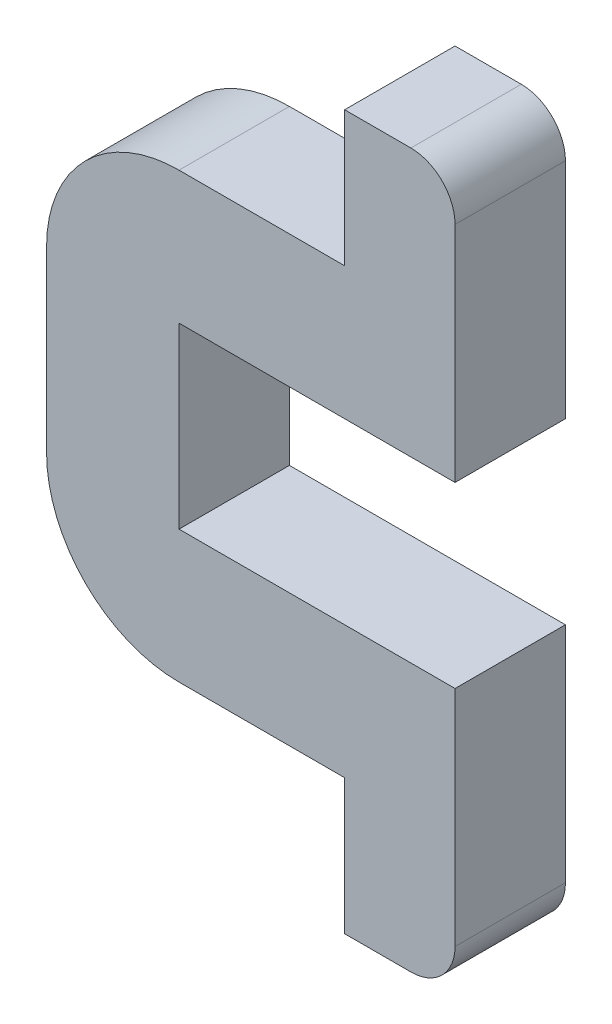
ISO-10303-21;
HEADER;
FILE_DESCRIPTION(('STEP AP214'),'2;1');
FILE_NAME('part.step','',(''),(''),'','','');
FILE_SCHEMA(('AUTOMOTIVE_DESIGN { 1 0 10303 214 1 1 1 1 }'));
ENDSEC;
DATA;
#1=APPLICATION_CONTEXT('core data for automotive mechanical design processes');
#2=APPLICATION_PROTOCOL_DEFINITION('international standard','automotive_design',2000,#1);
#3=PRODUCT_CONTEXT('',#1,'mechanical');
#4=PRODUCT('Part','Part','',(#3));
#5=PRODUCT_RELATED_PRODUCT_CATEGORY('part','',(#4));
#6=PRODUCT_DEFINITION_FORMATION('','',#4);
#7=PRODUCT_DEFINITION_CONTEXT('part definition',#1,'design');
#8=PRODUCT_DEFINITION('design','',#6,#7);
#9=PRODUCT_DEFINITION_SHAPE('','',#8);
#10=(LENGTH_UNIT() NAMED_UNIT(*) SI_UNIT(.MILLI.,.METRE.));
#11=(NAMED_UNIT(*) PLANE_ANGLE_UNIT() SI_UNIT($,.RADIAN.));
#12=(NAMED_UNIT(*) SI_UNIT($,.STERADIAN.) SOLID_ANGLE_UNIT());
#13=UNCERTAINTY_MEASURE_WITH_UNIT(LENGTH_MEASURE(1.E-05),#10,'distance_accuracy_value','');
#14=(GEOMETRIC_REPRESENTATION_CONTEXT(3) GLOBAL_UNCERTAINTY_ASSIGNED_CONTEXT((#13)) GLOBAL_UNIT_ASSIGNED_CONTEXT((#10,
#11,#12)) REPRESENTATION_CONTEXT('',''));
#15=CARTESIAN_POINT('',(0.,0.,0.));
#16=DIRECTION('',(0.,0.,1.));
#17=DIRECTION('',(1.,0.,0.));
#18=AXIS2_PLACEMENT_3D('',#15,#16,#17);
#19=CARTESIAN_POINT('',(0.,-0.606,0.125));
#20=DIRECTION('',(-1.,0.,0.));
#21=DIRECTION('',(0.,0.,1.));
#22=AXIS2_PLACEMENT_3D('',#19,#20,#21);
#23=PLANE('',#22);
#24=DIRECTION('',(0.,1.,0.));
#25=VECTOR('',#24,1.);
#26=CARTESIAN_POINT('',(0.,-0.606,0.125));
#27=LINE('',#26,#25);
#28=CARTESIAN_POINT('',(0.,-0.506,0.125));
#29=VERTEX_POINT('',#28);
#30=CARTESIAN_POINT('',(0.,0.,0.125));
#31=VERTEX_POINT('',#30);
#32=EDGE_CURVE('E143',#29,#31,#27,.T.);
#33=ORIENTED_EDGE('',*,*,#32,.F.);
#34=DIRECTION('',(0.,0.,-1.));
#35=VECTOR('',#34,1.);
#36=CARTESIAN_POINT('',(0.,-0.506,0.125));
#37=LINE('',#36,#35);
#38=CARTESIAN_POINT('',(0.,-0.506,-0.125));
#39=VERTEX_POINT('',#38);
#40=EDGE_CURVE('E41',#29,#39,#37,.T.);
#41=ORIENTED_EDGE('',*,*,#40,.T.);
#42=DIRECTION('',(0.,1.,0.));
#43=VECTOR('',#42,1.);
#44=CARTESIAN_POINT('',(0.,-0.606,-0.125));
#45=LINE('',#44,#43);
#46=CARTESIAN_POINT('',(0.,0.,-0.125));
#47=VERTEX_POINT('',#46);
#48=EDGE_CURVE('E165',#39,#47,#45,.T.);
#49=ORIENTED_EDGE('',*,*,#48,.T.);
#50=DIRECTION('',(0.,0.,-1.));
#51=VECTOR('',#50,1.);
#52=CARTESIAN_POINT('',(0.,0.,0.125));
#53=LINE('',#52,#51);
#54=EDGE_CURVE('E158',#31,#47,#53,.T.);
#55=ORIENTED_EDGE('',*,*,#54,.F.);
#56=EDGE_LOOP('',(#33,#41,#49,#55));
#57=FACE_BOUND('',#56,.T.);
#58=ADVANCED_FACE('F33',(#57),#23,.F.);
#59=CARTESIAN_POINT('',(0.,0.,0.125));
#60=DIRECTION('',(0.,-1.,0.));
#61=DIRECTION('',(1.,0.,0.));
#62=AXIS2_PLACEMENT_3D('',#59,#60,#61);
#63=PLANE('',#62);
#64=DIRECTION('',(-1.,0.,0.));
#65=VECTOR('',#64,1.);
#66=CARTESIAN_POINT('',(0.,0.,-0.125));
#67=LINE('',#66,#65);
#68=CARTESIAN_POINT('',(-0.625,0.,-0.125));
#69=VERTEX_POINT('',#68);
#70=EDGE_CURVE('E207',#47,#69,#67,.T.);
#71=ORIENTED_EDGE('',*,*,#70,.T.);
#72=DIRECTION('',(0.,0.,-1.));
#73=VECTOR('',#72,1.);
#74=CARTESIAN_POINT('',(-0.625,0.,0.125));
#75=LINE('',#74,#73);
#76=CARTESIAN_POINT('',(-0.625,0.,0.125));
#77=VERTEX_POINT('',#76);
#78=EDGE_CURVE('E160',#77,#69,#75,.T.);
#79=ORIENTED_EDGE('',*,*,#78,.F.);
#80=DIRECTION('',(-1.,0.,0.));
#81=VECTOR('',#80,1.);
#82=CARTESIAN_POINT('',(0.,0.,0.125));
#83=LINE('',#82,#81);
#84=EDGE_CURVE('E147',#31,#77,#83,.T.);
#85=ORIENTED_EDGE('',*,*,#84,.F.);
#86=ORIENTED_EDGE('',*,*,#54,.T.);
#87=EDGE_LOOP('',(#71,#79,#85,#86));
#88=FACE_BOUND('',#87,.T.);
#89=ADVANCED_FACE('F157',(#88),#63,.F.);
#90=CARTESIAN_POINT('',(-0.625,0.,0.125));
#91=DIRECTION('',(-1.,0.,0.));
#92=DIRECTION('',(0.,0.,1.));
#93=AXIS2_PLACEMENT_3D('',#90,#91,#92);
#94=PLANE('',#93);
#95=DIRECTION('',(0.,1.,0.));
#96=VECTOR('',#95,1.);
#97=CARTESIAN_POINT('',(-0.625,0.,-0.125));
#98=LINE('',#97,#96);
#99=CARTESIAN_POINT('',(-0.625,0.404,-0.125));
#100=VERTEX_POINT('',#99);
#101=EDGE_CURVE('E209',#69,#100,#98,.T.);
#102=ORIENTED_EDGE('',*,*,#101,.T.);
#103=DIRECTION('',(0.,0.,-1.));
#104=VECTOR('',#103,1.);
#105=CARTESIAN_POINT('',(-0.625,0.404,0.125));
#106=LINE('',#105,#104);
#107=CARTESIAN_POINT('',(-0.625,0.404,0.125));
#108=VERTEX_POINT('',#107);
#109=EDGE_CURVE('E172',#108,#100,#106,.T.);
#110=ORIENTED_EDGE('',*,*,#109,.F.);
#111=DIRECTION('',(0.,1.,0.));
#112=VECTOR('',#111,1.);
#113=CARTESIAN_POINT('',(-0.625,0.,0.125));
#114=LINE('',#113,#112);
#115=EDGE_CURVE('E162',#77,#108,#114,.T.);
#116=ORIENTED_EDGE('',*,*,#115,.F.);
#117=ORIENTED_EDGE('',*,*,#78,.T.);
#118=EDGE_LOOP('',(#102,#110,#116,#117));
#119=FACE_BOUND('',#118,.T.);
#120=ADVANCED_FACE('F301',(#119),#94,.F.);
#121=CARTESIAN_POINT('',(-0.625,0.404,0.125));
#122=DIRECTION('',(0.,1.,0.));
#123=DIRECTION('',(-1.,0.,0.));
#124=AXIS2_PLACEMENT_3D('',#121,#122,#123);
#125=PLANE('',#124);
#126=DIRECTION('',(1.,0.,0.));
#127=VECTOR('',#126,1.);
#128=CARTESIAN_POINT('',(-0.625,0.404,-0.125));
#129=LINE('',#128,#127);
#130=CARTESIAN_POINT('',(0.,0.404,-0.125));
#131=VERTEX_POINT('',#130);
#132=EDGE_CURVE('E216',#100,#131,#129,.T.);
#133=ORIENTED_EDGE('',*,*,#132,.T.);
#134=DIRECTION('',(0.,0.,-1.));
#135=VECTOR('',#134,1.);
#136=CARTESIAN_POINT('',(0.,0.404,0.125));
#137=LINE('',#136,#135);
#138=CARTESIAN_POINT('',(0.,0.404,0.125));
#139=VERTEX_POINT('',#138);
#140=EDGE_CURVE('E248',#139,#131,#137,.T.);
#141=ORIENTED_EDGE('',*,*,#140,.F.);
#142=DIRECTION('',(1.,0.,0.));
#143=VECTOR('',#142,1.);
#144=CARTESIAN_POINT('',(-0.625,0.404,0.125));
#145=LINE('',#144,#143);
#146=EDGE_CURVE('E257',#108,#139,#145,.T.);
#147=ORIENTED_EDGE('',*,*,#146,.F.);
#148=ORIENTED_EDGE('',*,*,#109,.T.);
#149=EDGE_LOOP('',(#133,#141,#147,#148));
#150=FACE_BOUND('',#149,.T.);
#151=ADVANCED_FACE('F255',(#150),#125,.F.);
#152=CARTESIAN_POINT('',(0.,0.404,0.125));
#153=DIRECTION('',(-1.,0.,0.));
#154=DIRECTION('',(0.,-1.,0.));
#155=AXIS2_PLACEMENT_3D('',#152,#153,#154);
#156=PLANE('',#155);
#157=DIRECTION('',(0.,1.,0.));
#158=VECTOR('',#157,1.);
#159=CARTESIAN_POINT('',(0.,0.404,-0.125));
#160=LINE('',#159,#158);
#161=CARTESIAN_POINT('',(0.,0.91,-0.125));
#162=VERTEX_POINT('',#161);
#163=EDGE_CURVE('E218',#131,#162,#160,.T.);
#164=ORIENTED_EDGE('',*,*,#163,.T.);
#165=DIRECTION('',(0.,0.,-1.));
#166=VECTOR('',#165,1.);
#167=CARTESIAN_POINT('',(0.,0.91,0.125));
#168=LINE('',#167,#166);
#169=CARTESIAN_POINT('',(0.,0.91,0.125));
#170=VERTEX_POINT('',#169);
#171=EDGE_CURVE('E197',#162,#170,#168,.F.);
#172=ORIENTED_EDGE('',*,*,#171,.T.);
#173=DIRECTION('',(0.,1.,0.));
#174=VECTOR('',#173,1.);
#175=CARTESIAN_POINT('',(0.,0.404,0.125));
#176=LINE('',#175,#174);
#177=EDGE_CURVE('E271',#139,#170,#176,.T.);
#178=ORIENTED_EDGE('',*,*,#177,.F.);
#179=ORIENTED_EDGE('',*,*,#140,.T.);
#180=EDGE_LOOP('',(#164,#172,#178,#179));
#181=FACE_BOUND('',#180,.T.);
#182=ADVANCED_FACE('F262',(#181),#156,.F.);
#183=CARTESIAN_POINT('',(0.,1.01,0.125));
#184=DIRECTION('',(0.,-1.,0.));
#185=DIRECTION('',(0.,0.,-1.));
#186=AXIS2_PLACEMENT_3D('',#183,#184,#185);
#187=PLANE('',#186);
#188=DIRECTION('',(-1.,0.,0.));
#189=VECTOR('',#188,1.);
#190=CARTESIAN_POINT('',(0.,1.01,0.125));
#191=LINE('',#190,#189);
#192=CARTESIAN_POINT('',(-0.1,1.01,0.125));
#193=VERTEX_POINT('',#192);
#194=CARTESIAN_POINT('',(-0.25,1.01,0.125));
#195=VERTEX_POINT('',#194);
#196=EDGE_CURVE('E269',#193,#195,#191,.T.);
#197=ORIENTED_EDGE('',*,*,#196,.F.);
#198=DIRECTION('',(0.,0.,-1.));
#199=VECTOR('',#198,1.);
#200=CARTESIAN_POINT('',(-0.1,1.01,0.125));
#201=LINE('',#200,#199);
#202=CARTESIAN_POINT('',(-0.1,1.01,-0.125));
#203=VERTEX_POINT('',#202);
#204=EDGE_CURVE('E190',#193,#203,#201,.T.);
#205=ORIENTED_EDGE('',*,*,#204,.T.);
#206=DIRECTION('',(-1.,0.,0.));
#207=VECTOR('',#206,1.);
#208=CARTESIAN_POINT('',(0.,1.01,-0.125));
#209=LINE('',#208,#207);
#210=CARTESIAN_POINT('',(-0.25,1.01,-0.125));
#211=VERTEX_POINT('',#210);
#212=EDGE_CURVE('E221',#203,#211,#209,.T.);
#213=ORIENTED_EDGE('',*,*,#212,.T.);
#214=DIRECTION('',(0.,0.,-1.));
#215=VECTOR('',#214,1.);
#216=CARTESIAN_POINT('',(-0.25,1.01,0.125));
#217=LINE('',#216,#215);
#218=EDGE_CURVE('E245',#195,#211,#217,.T.);
#219=ORIENTED_EDGE('',*,*,#218,.F.);
#220=EDGE_LOOP('',(#197,#205,#213,#219));
#221=FACE_BOUND('',#220,.T.);
#222=ADVANCED_FACE('F273',(#221),#187,.F.);
#223=CARTESIAN_POINT('',(-0.25,1.01,0.125));
#224=DIRECTION('',(1.,0.,0.));
#225=DIRECTION('',(0.,1.,0.));
#226=AXIS2_PLACEMENT_3D('',#223,#224,#225);
#227=PLANE('',#226);
#228=DIRECTION('',(0.,-1.,0.));
#229=VECTOR('',#228,1.);
#230=CARTESIAN_POINT('',(-0.25,1.01,-0.125));
#231=LINE('',#230,#229);
#232=CARTESIAN_POINT('',(-0.25,0.704,-0.125));
#233=VERTEX_POINT('',#232);
#234=EDGE_CURVE('E223',#211,#233,#231,.T.);
#235=ORIENTED_EDGE('',*,*,#234,.T.);
#236=DIRECTION('',(0.,0.,-1.));
#237=VECTOR('',#236,1.);
#238=CARTESIAN_POINT('',(-0.25,0.704,0.125));
#239=LINE('',#238,#237);
#240=CARTESIAN_POINT('',(-0.25,0.704,0.125));
#241=VERTEX_POINT('',#240);
#242=EDGE_CURVE('E242',#241,#233,#239,.T.);
#243=ORIENTED_EDGE('',*,*,#242,.F.);
#244=DIRECTION('',(0.,-1.,0.));
#245=VECTOR('',#244,1.);
#246=CARTESIAN_POINT('',(-0.25,1.01,0.125));
#247=LINE('',#246,#245);
#248=EDGE_CURVE('E275',#195,#241,#247,.T.);
#249=ORIENTED_EDGE('',*,*,#248,.F.);
#250=ORIENTED_EDGE('',*,*,#218,.T.);
#251=EDGE_LOOP('',(#235,#243,#249,#250));
#252=FACE_BOUND('',#251,.T.);
#253=ADVANCED_FACE('F339',(#252),#227,.F.);
#254=CARTESIAN_POINT('',(-0.25,0.704,0.125));
#255=DIRECTION('',(0.,-1.,0.));
#256=DIRECTION('',(0.,0.,-1.));
#257=AXIS2_PLACEMENT_3D('',#254,#255,#256);
#258=PLANE('',#257);
#259=DIRECTION('',(-1.,0.,0.));
#260=VECTOR('',#259,1.);
#261=CARTESIAN_POINT('',(-0.25,0.704,-0.125));
#262=LINE('',#261,#260);
#263=CARTESIAN_POINT('',(-0.625,0.704,-0.125));
#264=VERTEX_POINT('',#263);
#265=EDGE_CURVE('E225',#233,#264,#262,.T.);
#266=ORIENTED_EDGE('',*,*,#265,.T.);
#267=DIRECTION('',(0.,0.,-1.));
#268=VECTOR('',#267,1.);
#269=CARTESIAN_POINT('',(-0.625,0.704,0.125));
#270=LINE('',#269,#268);
#271=CARTESIAN_POINT('',(-0.625,0.704,0.125));
#272=VERTEX_POINT('',#271);
#273=EDGE_CURVE('E188',#264,#272,#270,.F.);
#274=ORIENTED_EDGE('',*,*,#273,.T.);
#275=DIRECTION('',(-1.,0.,0.));
#276=VECTOR('',#275,1.);
#277=CARTESIAN_POINT('',(-0.25,0.704,0.125));
#278=LINE('',#277,#276);
#279=EDGE_CURVE('E277',#241,#272,#278,.T.);
#280=ORIENTED_EDGE('',*,*,#279,.F.);
#281=ORIENTED_EDGE('',*,*,#242,.T.);
#282=EDGE_LOOP('',(#266,#274,#280,#281));
#283=FACE_BOUND('',#282,.T.);
#284=ADVANCED_FACE('F336',(#283),#258,.F.);
#285=CARTESIAN_POINT('',(-0.925,0.704,0.125));
#286=DIRECTION('',(1.,0.,0.));
#287=DIRECTION('',(0.,1.,0.));
#288=AXIS2_PLACEMENT_3D('',#285,#286,#287);
#289=PLANE('',#288);
#290=DIRECTION('',(0.,-1.,0.));
#291=VECTOR('',#290,1.);
#292=CARTESIAN_POINT('',(-0.925,0.704,-0.125));
#293=LINE('',#292,#291);
#294=CARTESIAN_POINT('',(-0.925,0.404,-0.125));
#295=VERTEX_POINT('',#294);
#296=CARTESIAN_POINT('',(-0.925,0.,-0.125));
#297=VERTEX_POINT('',#296);
#298=EDGE_CURVE('E228',#295,#297,#293,.T.);
#299=ORIENTED_EDGE('',*,*,#298,.T.);
#300=DIRECTION('',(0.,0.,-1.));
#301=VECTOR('',#300,1.);
#302=CARTESIAN_POINT('',(-0.925,0.,0.125));
#303=LINE('',#302,#301);
#304=CARTESIAN_POINT('',(-0.925,0.,0.125));
#305=VERTEX_POINT('',#304);
#306=EDGE_CURVE('E182',#297,#305,#303,.F.);
#307=ORIENTED_EDGE('',*,*,#306,.T.);
#308=DIRECTION('',(0.,-1.,0.));
#309=VECTOR('',#308,1.);
#310=CARTESIAN_POINT('',(-0.925,0.704,0.125));
#311=LINE('',#310,#309);
#312=CARTESIAN_POINT('',(-0.925,0.404,0.125));
#313=VERTEX_POINT('',#312);
#314=EDGE_CURVE('E284',#313,#305,#311,.T.);
#315=ORIENTED_EDGE('',*,*,#314,.F.);
#316=DIRECTION('',(0.,0.,-1.));
#317=VECTOR('',#316,1.);
#318=CARTESIAN_POINT('',(-0.925,0.404,0.125));
#319=LINE('',#318,#317);
#320=EDGE_CURVE('E179',#313,#295,#319,.T.);
#321=ORIENTED_EDGE('',*,*,#320,.T.);
#322=EDGE_LOOP('',(#299,#307,#315,#321));
#323=FACE_BOUND('',#322,.T.);
#324=ADVANCED_FACE('F320',(#323),#289,.F.);
#325=CARTESIAN_POINT('',(-0.925,-0.3,0.125));
#326=DIRECTION('',(0.,1.,0.));
#327=DIRECTION('',(-1.,0.,0.));
#328=AXIS2_PLACEMENT_3D('',#325,#326,#327);
#329=PLANE('',#328);
#330=DIRECTION('',(1.,0.,0.));
#331=VECTOR('',#330,1.);
#332=CARTESIAN_POINT('',(-0.925,-0.3,0.125));
#333=LINE('',#332,#331);
#334=CARTESIAN_POINT('',(-0.625,-0.3,0.125));
#335=VERTEX_POINT('',#334);
#336=CARTESIAN_POINT('',(-0.25,-0.3,0.125));
#337=VERTEX_POINT('',#336);
#338=EDGE_CURVE('E287',#335,#337,#333,.T.);
#339=ORIENTED_EDGE('',*,*,#338,.F.);
#340=DIRECTION('',(0.,0.,-1.));
#341=VECTOR('',#340,1.);
#342=CARTESIAN_POINT('',(-0.625,-0.3,0.125));
#343=LINE('',#342,#341);
#344=CARTESIAN_POINT('',(-0.625,-0.3,-0.125));
#345=VERTEX_POINT('',#344);
#346=EDGE_CURVE('E167',#335,#345,#343,.T.);
#347=ORIENTED_EDGE('',*,*,#346,.T.);
#348=DIRECTION('',(1.,0.,0.));
#349=VECTOR('',#348,1.);
#350=CARTESIAN_POINT('',(-0.925,-0.3,-0.125));
#351=LINE('',#350,#349);
#352=CARTESIAN_POINT('',(-0.25,-0.3,-0.125));
#353=VERTEX_POINT('',#352);
#354=EDGE_CURVE('E231',#345,#353,#351,.T.);
#355=ORIENTED_EDGE('',*,*,#354,.T.);
#356=DIRECTION('',(0.,0.,-1.));
#357=VECTOR('',#356,1.);
#358=CARTESIAN_POINT('',(-0.25,-0.3,0.125));
#359=LINE('',#358,#357);
#360=EDGE_CURVE('E239',#337,#353,#359,.T.);
#361=ORIENTED_EDGE('',*,*,#360,.F.);
#362=EDGE_LOOP('',(#339,#347,#355,#361));
#363=FACE_BOUND('',#362,.T.);
#364=ADVANCED_FACE('F327',(#363),#329,.F.);
#365=CARTESIAN_POINT('',(-0.25,-0.3,0.125));
#366=DIRECTION('',(1.,0.,0.));
#367=DIRECTION('',(0.,1.,0.));
#368=AXIS2_PLACEMENT_3D('',#365,#366,#367);
#369=PLANE('',#368);
#370=DIRECTION('',(0.,-1.,0.));
#371=VECTOR('',#370,1.);
#372=CARTESIAN_POINT('',(-0.25,-0.3,-0.125));
#373=LINE('',#372,#371);
#374=CARTESIAN_POINT('',(-0.25,-0.606,-0.125));
#375=VERTEX_POINT('',#374);
#376=EDGE_CURVE('E233',#353,#375,#373,.T.);
#377=ORIENTED_EDGE('',*,*,#376,.T.);
#378=DIRECTION('',(0.,0.,-1.));
#379=VECTOR('',#378,1.);
#380=CARTESIAN_POINT('',(-0.25,-0.606,0.125));
#381=LINE('',#380,#379);
#382=CARTESIAN_POINT('',(-0.25,-0.606,0.125));
#383=VERTEX_POINT('',#382);
#384=EDGE_CURVE('E236',#383,#375,#381,.T.);
#385=ORIENTED_EDGE('',*,*,#384,.F.);
#386=DIRECTION('',(0.,-1.,0.));
#387=VECTOR('',#386,1.);
#388=CARTESIAN_POINT('',(-0.25,-0.3,0.125));
#389=LINE('',#388,#387);
#390=EDGE_CURVE('E288',#337,#383,#389,.T.);
#391=ORIENTED_EDGE('',*,*,#390,.F.);
#392=ORIENTED_EDGE('',*,*,#360,.T.);
#393=EDGE_LOOP('',(#377,#385,#391,#392));
#394=FACE_BOUND('',#393,.T.);
#395=ADVANCED_FACE('F331',(#394),#369,.F.);
#396=CARTESIAN_POINT('',(-0.25,-0.606,0.125));
#397=DIRECTION('',(0.,1.,0.));
#398=DIRECTION('',(0.,0.,1.));
#399=AXIS2_PLACEMENT_3D('',#396,#397,#398);
#400=PLANE('',#399);
#401=DIRECTION('',(1.,0.,0.));
#402=VECTOR('',#401,1.);
#403=CARTESIAN_POINT('',(-0.25,-0.606,-0.125));
#404=LINE('',#403,#402);
#405=CARTESIAN_POINT('',(-0.1,-0.606,-0.125));
#406=VERTEX_POINT('',#405);
#407=EDGE_CURVE('E153',#375,#406,#404,.T.);
#408=ORIENTED_EDGE('',*,*,#407,.T.);
#409=DIRECTION('',(0.,0.,-1.));
#410=VECTOR('',#409,1.);
#411=CARTESIAN_POINT('',(-0.1,-0.606,0.125));
#412=LINE('',#411,#410);
#413=CARTESIAN_POINT('',(-0.1,-0.606,0.125));
#414=VERTEX_POINT('',#413);
#415=EDGE_CURVE('E11',#406,#414,#412,.F.);
#416=ORIENTED_EDGE('',*,*,#415,.T.);
#417=DIRECTION('',(1.,0.,0.));
#418=VECTOR('',#417,1.);
#419=CARTESIAN_POINT('',(-0.25,-0.606,0.125));
#420=LINE('',#419,#418);
#421=EDGE_CURVE('E212',#383,#414,#420,.T.);
#422=ORIENTED_EDGE('',*,*,#421,.F.);
#423=ORIENTED_EDGE('',*,*,#384,.T.);
#424=EDGE_LOOP('',(#408,#416,#422,#423));
#425=FACE_BOUND('',#424,.T.);
#426=ADVANCED_FACE('F332',(#425),#400,.F.);
#427=CARTESIAN_POINT('',(0.,0.,0.125));
#428=DIRECTION('',(0.,0.,1.));
#429=DIRECTION('',(1.,0.,0.));
#430=AXIS2_PLACEMENT_3D('',#427,#428,#429);
#431=PLANE('',#430);
#432=ORIENTED_EDGE('',*,*,#177,.T.);
#433=CARTESIAN_POINT('',(-0.1,0.91,0.125));
#434=DIRECTION('',(0.,0.,1.));
#435=DIRECTION('',(1.,0.,0.));
#436=AXIS2_PLACEMENT_3D('',#433,#434,#435);
#437=CIRCLE('',#436,0.1);
#438=EDGE_CURVE('E200',#170,#193,#437,.T.);
#439=ORIENTED_EDGE('',*,*,#438,.T.);
#440=ORIENTED_EDGE('',*,*,#196,.T.);
#441=ORIENTED_EDGE('',*,*,#248,.T.);
#442=ORIENTED_EDGE('',*,*,#279,.T.);
#443=CARTESIAN_POINT('',(-0.625,0.404,0.125));
#444=DIRECTION('',(0.,0.,1.));
#445=DIRECTION('',(1.,0.,0.));
#446=AXIS2_PLACEMENT_3D('',#443,#444,#445);
#447=CIRCLE('',#446,0.3);
#448=EDGE_CURVE('E184',#272,#313,#447,.T.);
#449=ORIENTED_EDGE('',*,*,#448,.T.);
#450=ORIENTED_EDGE('',*,*,#314,.T.);
#451=CARTESIAN_POINT('',(-0.625,0.,0.125));
#452=DIRECTION('',(0.,0.,1.));
#453=DIRECTION('',(1.,0.,0.));
#454=AXIS2_PLACEMENT_3D('',#451,#452,#453);
#455=CIRCLE('',#454,0.3);
#456=EDGE_CURVE('E186',#305,#335,#455,.T.);
#457=ORIENTED_EDGE('',*,*,#456,.T.);
#458=ORIENTED_EDGE('',*,*,#338,.T.);
#459=ORIENTED_EDGE('',*,*,#390,.T.);
#460=ORIENTED_EDGE('',*,*,#421,.T.);
#461=CARTESIAN_POINT('',(-0.1,-0.506,0.125));
#462=DIRECTION('',(0.,0.,1.));
#463=DIRECTION('',(1.,0.,0.));
#464=AXIS2_PLACEMENT_3D('',#461,#462,#463);
#465=CIRCLE('',#464,0.1);
#466=EDGE_CURVE('E48',#414,#29,#465,.T.);
#467=ORIENTED_EDGE('',*,*,#466,.T.);
#468=ORIENTED_EDGE('',*,*,#32,.T.);
#469=ORIENTED_EDGE('',*,*,#84,.T.);
#470=ORIENTED_EDGE('',*,*,#115,.T.);
#471=ORIENTED_EDGE('',*,*,#146,.T.);
#472=EDGE_LOOP('',(#432,#439,#440,#441,#442,#449,#450,#457,#458,#459,#460,#467,#468,#469,#470,#471));
#473=FACE_BOUND('',#472,.T.);
#474=ADVANCED_FACE('F146',(#473),#431,.T.);
#475=CARTESIAN_POINT('',(0.,0.,-0.125));
#476=DIRECTION('',(0.,0.,1.));
#477=DIRECTION('',(1.,0.,0.));
#478=AXIS2_PLACEMENT_3D('',#475,#476,#477);
#479=PLANE('',#478);
#480=ORIENTED_EDGE('',*,*,#212,.F.);
#481=CARTESIAN_POINT('',(-0.1,0.91,-0.125));
#482=DIRECTION('',(0.,0.,1.));
#483=DIRECTION('',(1.,0.,0.));
#484=AXIS2_PLACEMENT_3D('',#481,#482,#483);
#485=CIRCLE('',#484,0.1);
#486=EDGE_CURVE('E195',#203,#162,#485,.F.);
#487=ORIENTED_EDGE('',*,*,#486,.T.);
#488=ORIENTED_EDGE('',*,*,#163,.F.);
#489=ORIENTED_EDGE('',*,*,#132,.F.);
#490=ORIENTED_EDGE('',*,*,#101,.F.);
#491=ORIENTED_EDGE('',*,*,#70,.F.);
#492=ORIENTED_EDGE('',*,*,#48,.F.);
#493=CARTESIAN_POINT('',(-0.1,-0.506,-0.125));
#494=DIRECTION('',(0.,0.,1.));
#495=DIRECTION('',(1.,0.,0.));
#496=AXIS2_PLACEMENT_3D('',#493,#494,#495);
#497=CIRCLE('',#496,0.1);
#498=EDGE_CURVE('E193',#39,#406,#497,.F.);
#499=ORIENTED_EDGE('',*,*,#498,.T.);
#500=ORIENTED_EDGE('',*,*,#407,.F.);
#501=ORIENTED_EDGE('',*,*,#376,.F.);
#502=ORIENTED_EDGE('',*,*,#354,.F.);
#503=CARTESIAN_POINT('',(-0.625,0.,-0.125));
#504=DIRECTION('',(0.,0.,1.));
#505=DIRECTION('',(1.,0.,0.));
#506=AXIS2_PLACEMENT_3D('',#503,#504,#505);
#507=CIRCLE('',#506,0.3);
#508=EDGE_CURVE('E177',#345,#297,#507,.F.);
#509=ORIENTED_EDGE('',*,*,#508,.T.);
#510=ORIENTED_EDGE('',*,*,#298,.F.);
#511=CARTESIAN_POINT('',(-0.625,0.404,-0.125));
#512=DIRECTION('',(0.,0.,1.));
#513=DIRECTION('',(1.,0.,0.));
#514=AXIS2_PLACEMENT_3D('',#511,#512,#513);
#515=CIRCLE('',#514,0.3);
#516=EDGE_CURVE('E170',#295,#264,#515,.F.);
#517=ORIENTED_EDGE('',*,*,#516,.T.);
#518=ORIENTED_EDGE('',*,*,#265,.F.);
#519=ORIENTED_EDGE('',*,*,#234,.F.);
#520=EDGE_LOOP('',(#480,#487,#488,#489,#490,#491,#492,#499,#500,#501,#502,#509,#510,#517,#518,#519));
#521=FACE_BOUND('',#520,.T.);
#522=ADVANCED_FACE('F204',(#521),#479,.F.);
#523=CARTESIAN_POINT('',(-0.625,0.,0.125));
#524=DIRECTION('',(0.,0.,-1.));
#525=DIRECTION('',(-1.,0.,0.));
#526=AXIS2_PLACEMENT_3D('',#523,#524,#525);
#527=CYLINDRICAL_SURFACE('',#526,0.3);
#528=ORIENTED_EDGE('',*,*,#456,.F.);
#529=ORIENTED_EDGE('',*,*,#306,.F.);
#530=ORIENTED_EDGE('',*,*,#508,.F.);
#531=ORIENTED_EDGE('',*,*,#346,.F.);
#532=EDGE_LOOP('',(#528,#529,#530,#531));
#533=FACE_BOUND('',#532,.T.);
#534=ADVANCED_FACE('F305',(#533),#527,.T.);
#535=CARTESIAN_POINT('',(-0.625,0.404,0.125));
#536=DIRECTION('',(0.,0.,-1.));
#537=DIRECTION('',(-1.,0.,0.));
#538=AXIS2_PLACEMENT_3D('',#535,#536,#537);
#539=CYLINDRICAL_SURFACE('',#538,0.3);
#540=ORIENTED_EDGE('',*,*,#448,.F.);
#541=ORIENTED_EDGE('',*,*,#273,.F.);
#542=ORIENTED_EDGE('',*,*,#516,.F.);
#543=ORIENTED_EDGE('',*,*,#320,.F.);
#544=EDGE_LOOP('',(#540,#541,#542,#543));
#545=FACE_BOUND('',#544,.T.);
#546=ADVANCED_FACE('F295',(#545),#539,.T.);
#547=CARTESIAN_POINT('',(-0.1,0.91,0.125));
#548=DIRECTION('',(0.,0.,-1.));
#549=DIRECTION('',(-1.,0.,0.));
#550=AXIS2_PLACEMENT_3D('',#547,#548,#549);
#551=CYLINDRICAL_SURFACE('',#550,0.1);
#552=ORIENTED_EDGE('',*,*,#438,.F.);
#553=ORIENTED_EDGE('',*,*,#171,.F.);
#554=ORIENTED_EDGE('',*,*,#486,.F.);
#555=ORIENTED_EDGE('',*,*,#204,.F.);
#556=EDGE_LOOP('',(#552,#553,#554,#555));
#557=FACE_BOUND('',#556,.T.);
#558=ADVANCED_FACE('F266',(#557),#551,.T.);
#559=CARTESIAN_POINT('',(-0.1,-0.506,0.125));
#560=DIRECTION('',(0.,0.,-1.));
#561=DIRECTION('',(-1.,0.,0.));
#562=AXIS2_PLACEMENT_3D('',#559,#560,#561);
#563=CYLINDRICAL_SURFACE('',#562,0.1);
#564=ORIENTED_EDGE('',*,*,#466,.F.);
#565=ORIENTED_EDGE('',*,*,#415,.F.);
#566=ORIENTED_EDGE('',*,*,#498,.F.);
#567=ORIENTED_EDGE('',*,*,#40,.F.);
#568=EDGE_LOOP('',(#564,#565,#566,#567));
#569=FACE_BOUND('',#568,.T.);
#570=ADVANCED_FACE('F35',(#569),#563,.T.);
#571=CLOSED_SHELL('',(#58,#89,#120,#151,#182,#222,#253,#284,#324,#364,#395,#426,#474,#522,#534,
#546,#558,#570));
#572=MANIFOLD_SOLID_BREP('B2',#571);
#573=ADVANCED_BREP_SHAPE_REPRESENTATION('',(#18,#572),#14);
#574=SHAPE_DEFINITION_REPRESENTATION(#9,#573);
ENDSEC;
END-ISO-10303-21;
